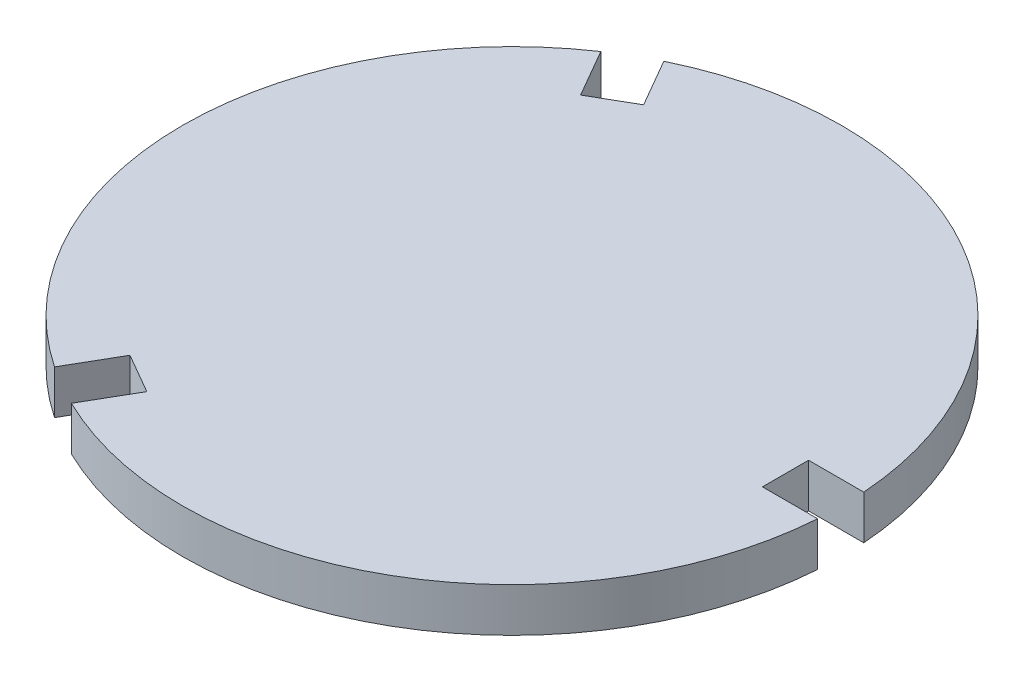
ISO-10303-21;
HEADER;
FILE_DESCRIPTION(('STEP AP214'),'2;1');
FILE_NAME('part.step','',(''),(''),'','','');
FILE_SCHEMA(('AUTOMOTIVE_DESIGN { 1 0 10303 214 1 1 1 1 }'));
ENDSEC;
DATA;
#1=APPLICATION_CONTEXT('core data for automotive mechanical design processes');
#2=APPLICATION_PROTOCOL_DEFINITION('international standard','automotive_design',2000,#1);
#3=PRODUCT_CONTEXT('',#1,'mechanical');
#4=PRODUCT('Part','Part','',(#3));
#5=PRODUCT_RELATED_PRODUCT_CATEGORY('part','',(#4));
#6=PRODUCT_DEFINITION_FORMATION('','',#4);
#7=PRODUCT_DEFINITION_CONTEXT('part definition',#1,'design');
#8=PRODUCT_DEFINITION('design','',#6,#7);
#9=PRODUCT_DEFINITION_SHAPE('','',#8);
#10=(LENGTH_UNIT() NAMED_UNIT(*) SI_UNIT(.MILLI.,.METRE.));
#11=(NAMED_UNIT(*) PLANE_ANGLE_UNIT() SI_UNIT($,.RADIAN.));
#12=(NAMED_UNIT(*) SI_UNIT($,.STERADIAN.) SOLID_ANGLE_UNIT());
#13=UNCERTAINTY_MEASURE_WITH_UNIT(LENGTH_MEASURE(1.E-05),#10,'distance_accuracy_value','');
#14=(GEOMETRIC_REPRESENTATION_CONTEXT(3) GLOBAL_UNCERTAINTY_ASSIGNED_CONTEXT((#13)) GLOBAL_UNIT_ASSIGNED_CONTEXT((#10,
#11,#12)) REPRESENTATION_CONTEXT('',''));
#15=CARTESIAN_POINT('',(0.,0.,0.));
#16=DIRECTION('',(0.,0.,1.));
#17=DIRECTION('',(1.,0.,0.));
#18=AXIS2_PLACEMENT_3D('',#15,#16,#17);
#19=CARTESIAN_POINT('',(0.,4.,0.));
#20=DIRECTION('',(0.,-1.,0.));
#21=DIRECTION('',(0.,0.,-1.));
#22=AXIS2_PLACEMENT_3D('',#19,#20,#21);
#23=CYLINDRICAL_SURFACE('',#22,30.);
#24=DIRECTION('',(0.,-1.,0.));
#25=VECTOR('',#24,1.);
#26=CARTESIAN_POINT('',(-16.7818582185622,4.,24.8670310799676));
#27=LINE('',#26,#25);
#28=CARTESIAN_POINT('',(-16.7818582185622,0.,24.8670310799676));
#29=VERTEX_POINT('',#28);
#30=CARTESIAN_POINT('',(-16.7818582185622,4.,24.8670310799676));
#31=VERTEX_POINT('',#30);
#32=EDGE_CURVE('E128',#29,#31,#27,.F.);
#33=ORIENTED_EDGE('',*,*,#32,.T.);
#34=CARTESIAN_POINT('',(0.,4.,0.));
#35=DIRECTION('',(0.,1.,0.));
#36=DIRECTION('',(0.,0.,1.));
#37=AXIS2_PLACEMENT_3D('',#34,#35,#36);
#38=CIRCLE('',#37,30.);
#39=CARTESIAN_POINT('',(-16.7818582185626,4.,-24.8670310799674));
#40=VERTEX_POINT('',#39);
#41=EDGE_CURVE('E43',#40,#31,#38,.T.);
#42=ORIENTED_EDGE('',*,*,#41,.F.);
#43=DIRECTION('',(0.,-1.,0.));
#44=VECTOR('',#43,1.);
#45=CARTESIAN_POINT('',(-16.7818582185626,4.,-24.8670310799674));
#46=LINE('',#45,#44);
#47=CARTESIAN_POINT('',(-16.7818582185626,0.,-24.8670310799674));
#48=VERTEX_POINT('',#47);
#49=EDGE_CURVE('E196',#40,#48,#46,.T.);
#50=ORIENTED_EDGE('',*,*,#49,.T.);
#51=CARTESIAN_POINT('',(0.,0.,0.));
#52=DIRECTION('',(0.,1.,0.));
#53=DIRECTION('',(0.,0.,1.));
#54=AXIS2_PLACEMENT_3D('',#51,#52,#53);
#55=CIRCLE('',#54,30.);
#56=EDGE_CURVE('E141',#48,#29,#55,.T.);
#57=ORIENTED_EDGE('',*,*,#56,.T.);
#58=EDGE_LOOP('',(#33,#42,#50,#57));
#59=FACE_BOUND('',#58,.T.);
#60=ADVANCED_FACE('F34',(#59),#23,.T.);
#61=DIRECTION('',(0.,-1.,0.));
#62=VECTOR('',#61,1.);
#63=CARTESIAN_POINT('',(-13.1445515226675,4.,26.9670310799676));
#64=LINE('',#63,#62);
#65=CARTESIAN_POINT('',(-13.1445515226675,4.,26.9670310799676));
#66=VERTEX_POINT('',#65);
#67=CARTESIAN_POINT('',(-13.1445515226675,0.,26.9670310799676));
#68=VERTEX_POINT('',#67);
#69=EDGE_CURVE('E142',#66,#68,#64,.T.);
#70=ORIENTED_EDGE('',*,*,#69,.T.);
#71=CARTESIAN_POINT('',(29.9264097412302,0.,2.1));
#72=VERTEX_POINT('',#71);
#73=EDGE_CURVE('E151',#68,#72,#55,.T.);
#74=ORIENTED_EDGE('',*,*,#73,.T.);
#75=DIRECTION('',(0.,-1.,0.));
#76=VECTOR('',#75,1.);
#77=CARTESIAN_POINT('',(29.9264097412302,4.,2.1));
#78=LINE('',#77,#76);
#79=CARTESIAN_POINT('',(29.9264097412302,4.,2.1));
#80=VERTEX_POINT('',#79);
#81=EDGE_CURVE('E171',#72,#80,#78,.F.);
#82=ORIENTED_EDGE('',*,*,#81,.T.);
#83=EDGE_CURVE('E44',#66,#80,#38,.T.);
#84=ORIENTED_EDGE('',*,*,#83,.F.);
#85=EDGE_LOOP('',(#70,#74,#82,#84));
#86=FACE_BOUND('',#85,.T.);
#87=ADVANCED_FACE('F214',(#86),#23,.T.);
#88=CARTESIAN_POINT('',(0.,4.,0.));
#89=DIRECTION('',(0.,1.,0.));
#90=DIRECTION('',(0.,0.,1.));
#91=AXIS2_PLACEMENT_3D('',#88,#89,#90);
#92=PLANE('',#91);
#93=ORIENTED_EDGE('',*,*,#41,.T.);
#94=DIRECTION('',(-0.499999999999992,0.,0.866025403784443));
#95=VECTOR('',#94,1.);
#96=CARTESIAN_POINT('',(-19.368653347947,4.,29.347491672834));
#97=LINE('',#96,#95);
#98=CARTESIAN_POINT('',(-14.2686533479471,4.,20.5140325542327));
#99=VERTEX_POINT('',#98);
#100=EDGE_CURVE('E125',#99,#31,#97,.T.);
#101=ORIENTED_EDGE('',*,*,#100,.F.);
#102=DIRECTION('',(-0.866025403784443,0.,-0.499999999999992));
#103=VECTOR('',#102,1.);
#104=CARTESIAN_POINT('',(-14.2686533479471,4.,20.5140325542327));
#105=LINE('',#104,#103);
#106=CARTESIAN_POINT('',(-10.6313466520525,4.,22.6140325542326));
#107=VERTEX_POINT('',#106);
#108=EDGE_CURVE('E134',#107,#99,#105,.T.);
#109=ORIENTED_EDGE('',*,*,#108,.F.);
#110=DIRECTION('',(0.499999999999992,0.,-0.866025403784443));
#111=VECTOR('',#110,1.);
#112=CARTESIAN_POINT('',(-15.7313466520524,4.,31.4474916728339));
#113=LINE('',#112,#111);
#114=EDGE_CURVE('E198',#66,#107,#113,.T.);
#115=ORIENTED_EDGE('',*,*,#114,.F.);
#116=ORIENTED_EDGE('',*,*,#83,.T.);
#117=DIRECTION('',(1.,0.,0.));
#118=VECTOR('',#117,1.);
#119=CARTESIAN_POINT('',(35.1,4.,2.1));
#120=LINE('',#119,#118);
#121=CARTESIAN_POINT('',(24.9,4.,2.1));
#122=VERTEX_POINT('',#121);
#123=EDGE_CURVE('E166',#122,#80,#120,.T.);
#124=ORIENTED_EDGE('',*,*,#123,.F.);
#125=DIRECTION('',(0.,0.,1.));
#126=VECTOR('',#125,1.);
#127=CARTESIAN_POINT('',(24.9,4.,2.1));
#128=LINE('',#127,#126);
#129=CARTESIAN_POINT('',(24.9,4.,-2.1));
#130=VERTEX_POINT('',#129);
#131=EDGE_CURVE('E169',#130,#122,#128,.T.);
#132=ORIENTED_EDGE('',*,*,#131,.F.);
#133=DIRECTION('',(-1.,0.,0.));
#134=VECTOR('',#133,1.);
#135=CARTESIAN_POINT('',(35.1,4.,-2.1));
#136=LINE('',#135,#134);
#137=CARTESIAN_POINT('',(29.9264097412302,4.,-2.1));
#138=VERTEX_POINT('',#137);
#139=EDGE_CURVE('E149',#138,#130,#136,.T.);
#140=ORIENTED_EDGE('',*,*,#139,.F.);
#141=CARTESIAN_POINT('',(-13.1445515226679,4.,-26.9670310799674));
#142=VERTEX_POINT('',#141);
#143=EDGE_CURVE('E11',#138,#142,#38,.T.);
#144=ORIENTED_EDGE('',*,*,#143,.T.);
#145=DIRECTION('',(-0.500000000000004,0.,-0.866025403784436));
#146=VECTOR('',#145,1.);
#147=CARTESIAN_POINT('',(-15.7313466520528,4.,-31.4474916728337));
#148=LINE('',#147,#146);
#149=CARTESIAN_POINT('',(-10.6313466520528,4.,-22.6140325542325));
#150=VERTEX_POINT('',#149);
#151=EDGE_CURVE('E189',#150,#142,#148,.T.);
#152=ORIENTED_EDGE('',*,*,#151,.F.);
#153=DIRECTION('',(0.866025403784436,0.,-0.500000000000004));
#154=VECTOR('',#153,1.);
#155=CARTESIAN_POINT('',(-10.6313466520528,4.,-22.6140325542325));
#156=LINE('',#155,#154);
#157=CARTESIAN_POINT('',(-14.2686533479474,4.,-20.5140325542325));
#158=VERTEX_POINT('',#157);
#159=EDGE_CURVE('E191',#158,#150,#156,.T.);
#160=ORIENTED_EDGE('',*,*,#159,.F.);
#161=DIRECTION('',(0.500000000000004,0.,0.866025403784436));
#162=VECTOR('',#161,1.);
#163=CARTESIAN_POINT('',(-19.3686533479475,4.,-29.3474916728337));
#164=LINE('',#163,#162);
#165=EDGE_CURVE('E147',#40,#158,#164,.T.);
#166=ORIENTED_EDGE('',*,*,#165,.F.);
#167=EDGE_LOOP('',(#93,#101,#109,#115,#116,#124,#132,#140,#144,#152,#160,#166));
#168=FACE_BOUND('',#167,.T.);
#169=ADVANCED_FACE('F145',(#168),#92,.T.);
#170=CARTESIAN_POINT('',(0.,0.,0.));
#171=DIRECTION('',(0.,1.,0.));
#172=DIRECTION('',(0.,0.,1.));
#173=AXIS2_PLACEMENT_3D('',#170,#171,#172);
#174=PLANE('',#173);
#175=DIRECTION('',(-0.499999999999992,0.,0.866025403784443));
#176=VECTOR('',#175,1.);
#177=CARTESIAN_POINT('',(-19.368653347947,0.,29.347491672834));
#178=LINE('',#177,#176);
#179=CARTESIAN_POINT('',(-14.2686533479471,0.,20.5140325542327));
#180=VERTEX_POINT('',#179);
#181=EDGE_CURVE('E51',#180,#29,#178,.T.);
#182=ORIENTED_EDGE('',*,*,#181,.T.);
#183=ORIENTED_EDGE('',*,*,#56,.F.);
#184=DIRECTION('',(0.500000000000004,0.,0.866025403784436));
#185=VECTOR('',#184,1.);
#186=CARTESIAN_POINT('',(-19.3686533479475,0.,-29.3474916728337));
#187=LINE('',#186,#185);
#188=CARTESIAN_POINT('',(-14.2686533479474,0.,-20.5140325542325));
#189=VERTEX_POINT('',#188);
#190=EDGE_CURVE('E182',#48,#189,#187,.T.);
#191=ORIENTED_EDGE('',*,*,#190,.T.);
#192=DIRECTION('',(0.866025403784436,0.,-0.500000000000004));
#193=VECTOR('',#192,1.);
#194=CARTESIAN_POINT('',(-10.6313466520528,0.,-22.6140325542325));
#195=LINE('',#194,#193);
#196=CARTESIAN_POINT('',(-10.6313466520528,0.,-22.6140325542325));
#197=VERTEX_POINT('',#196);
#198=EDGE_CURVE('E186',#189,#197,#195,.T.);
#199=ORIENTED_EDGE('',*,*,#198,.T.);
#200=DIRECTION('',(-0.500000000000004,0.,-0.866025403784436));
#201=VECTOR('',#200,1.);
#202=CARTESIAN_POINT('',(-15.7313466520528,0.,-31.4474916728337));
#203=LINE('',#202,#201);
#204=CARTESIAN_POINT('',(-13.1445515226679,0.,-26.9670310799674));
#205=VERTEX_POINT('',#204);
#206=EDGE_CURVE('E59',#197,#205,#203,.T.);
#207=ORIENTED_EDGE('',*,*,#206,.T.);
#208=CARTESIAN_POINT('',(29.9264097412302,0.,-2.1));
#209=VERTEX_POINT('',#208);
#210=EDGE_CURVE('E38',#209,#205,#55,.T.);
#211=ORIENTED_EDGE('',*,*,#210,.F.);
#212=DIRECTION('',(-1.,0.,0.));
#213=VECTOR('',#212,1.);
#214=CARTESIAN_POINT('',(35.1,0.,-2.1));
#215=LINE('',#214,#213);
#216=CARTESIAN_POINT('',(24.9,0.,-2.1));
#217=VERTEX_POINT('',#216);
#218=EDGE_CURVE('E157',#209,#217,#215,.T.);
#219=ORIENTED_EDGE('',*,*,#218,.T.);
#220=DIRECTION('',(0.,0.,1.));
#221=VECTOR('',#220,1.);
#222=CARTESIAN_POINT('',(24.9,0.,2.1));
#223=LINE('',#222,#221);
#224=CARTESIAN_POINT('',(24.9,0.,2.1));
#225=VERTEX_POINT('',#224);
#226=EDGE_CURVE('E163',#217,#225,#223,.T.);
#227=ORIENTED_EDGE('',*,*,#226,.T.);
#228=DIRECTION('',(1.,0.,0.));
#229=VECTOR('',#228,1.);
#230=CARTESIAN_POINT('',(35.1,0.,2.1));
#231=LINE('',#230,#229);
#232=EDGE_CURVE('E160',#225,#72,#231,.T.);
#233=ORIENTED_EDGE('',*,*,#232,.T.);
#234=ORIENTED_EDGE('',*,*,#73,.F.);
#235=DIRECTION('',(0.499999999999992,0.,-0.866025403784443));
#236=VECTOR('',#235,1.);
#237=CARTESIAN_POINT('',(-15.7313466520524,0.,31.4474916728339));
#238=LINE('',#237,#236);
#239=CARTESIAN_POINT('',(-10.6313466520525,0.,22.6140325542326));
#240=VERTEX_POINT('',#239);
#241=EDGE_CURVE('E203',#68,#240,#238,.T.);
#242=ORIENTED_EDGE('',*,*,#241,.T.);
#243=DIRECTION('',(-0.866025403784443,0.,-0.499999999999992));
#244=VECTOR('',#243,1.);
#245=CARTESIAN_POINT('',(-14.2686533479471,0.,20.5140325542327));
#246=LINE('',#245,#244);
#247=EDGE_CURVE('E133',#240,#180,#246,.T.);
#248=ORIENTED_EDGE('',*,*,#247,.T.);
#249=EDGE_LOOP('',(#182,#183,#191,#199,#207,#211,#219,#227,#233,#234,#242,#248));
#250=FACE_BOUND('',#249,.T.);
#251=ADVANCED_FACE('F219',(#250),#174,.F.);
#252=DIRECTION('',(0.,-1.,0.));
#253=VECTOR('',#252,1.);
#254=CARTESIAN_POINT('',(-13.1445515226679,4.,-26.9670310799674));
#255=LINE('',#254,#253);
#256=EDGE_CURVE('E193',#205,#142,#255,.F.);
#257=ORIENTED_EDGE('',*,*,#256,.T.);
#258=ORIENTED_EDGE('',*,*,#143,.F.);
#259=DIRECTION('',(0.,-1.,0.));
#260=VECTOR('',#259,1.);
#261=CARTESIAN_POINT('',(29.9264097412302,4.,-2.1));
#262=LINE('',#261,#260);
#263=EDGE_CURVE('E174',#138,#209,#262,.T.);
#264=ORIENTED_EDGE('',*,*,#263,.T.);
#265=ORIENTED_EDGE('',*,*,#210,.T.);
#266=EDGE_LOOP('',(#257,#258,#264,#265));
#267=FACE_BOUND('',#266,.T.);
#268=ADVANCED_FACE('F36',(#267),#23,.T.);
#269=CARTESIAN_POINT('',(35.1,4.001,2.1));
#270=DIRECTION('',(0.,0.,-1.));
#271=DIRECTION('',(-1.,0.,0.));
#272=AXIS2_PLACEMENT_3D('',#269,#270,#271);
#273=PLANE('',#272);
#274=ORIENTED_EDGE('',*,*,#232,.F.);
#275=DIRECTION('',(0.,-1.,0.));
#276=VECTOR('',#275,1.);
#277=CARTESIAN_POINT('',(24.9,4.001,2.1));
#278=LINE('',#277,#276);
#279=EDGE_CURVE('E152',#122,#225,#278,.T.);
#280=ORIENTED_EDGE('',*,*,#279,.F.);
#281=ORIENTED_EDGE('',*,*,#123,.T.);
#282=ORIENTED_EDGE('',*,*,#81,.F.);
#283=EDGE_LOOP('',(#274,#280,#281,#282));
#284=FACE_BOUND('',#283,.T.);
#285=ADVANCED_FACE('F241',(#284),#273,.T.);
#286=CARTESIAN_POINT('',(35.1,4.001,-2.1));
#287=DIRECTION('',(0.,0.,1.));
#288=DIRECTION('',(1.,0.,0.));
#289=AXIS2_PLACEMENT_3D('',#286,#287,#288);
#290=PLANE('',#289);
#291=ORIENTED_EDGE('',*,*,#139,.T.);
#292=DIRECTION('',(0.,-1.,0.));
#293=VECTOR('',#292,1.);
#294=CARTESIAN_POINT('',(24.9,4.001,-2.1));
#295=LINE('',#294,#293);
#296=EDGE_CURVE('E155',#130,#217,#295,.T.);
#297=ORIENTED_EDGE('',*,*,#296,.T.);
#298=ORIENTED_EDGE('',*,*,#218,.F.);
#299=ORIENTED_EDGE('',*,*,#263,.F.);
#300=EDGE_LOOP('',(#291,#297,#298,#299));
#301=FACE_BOUND('',#300,.T.);
#302=ADVANCED_FACE('F235',(#301),#290,.T.);
#303=CARTESIAN_POINT('',(24.9,4.001,2.1));
#304=DIRECTION('',(1.,0.,0.));
#305=DIRECTION('',(0.,0.,-1.));
#306=AXIS2_PLACEMENT_3D('',#303,#304,#305);
#307=PLANE('',#306);
#308=ORIENTED_EDGE('',*,*,#131,.T.);
#309=ORIENTED_EDGE('',*,*,#279,.T.);
#310=ORIENTED_EDGE('',*,*,#226,.F.);
#311=ORIENTED_EDGE('',*,*,#296,.F.);
#312=EDGE_LOOP('',(#308,#309,#310,#311));
#313=FACE_BOUND('',#312,.T.);
#314=ADVANCED_FACE('F238',(#313),#307,.T.);
#315=CARTESIAN_POINT('',(-15.7313466520528,4.001,-31.4474916728337));
#316=DIRECTION('',(-0.866025403784436,0.,0.500000000000004));
#317=DIRECTION('',(0.500000000000004,0.,0.866025403784436));
#318=AXIS2_PLACEMENT_3D('',#315,#316,#317);
#319=PLANE('',#318);
#320=ORIENTED_EDGE('',*,*,#206,.F.);
#321=DIRECTION('',(0.,-1.,0.));
#322=VECTOR('',#321,1.);
#323=CARTESIAN_POINT('',(-10.6313466520528,4.001,-22.6140325542325));
#324=LINE('',#323,#322);
#325=EDGE_CURVE('E178',#150,#197,#324,.T.);
#326=ORIENTED_EDGE('',*,*,#325,.F.);
#327=ORIENTED_EDGE('',*,*,#151,.T.);
#328=ORIENTED_EDGE('',*,*,#256,.F.);
#329=EDGE_LOOP('',(#320,#326,#327,#328));
#330=FACE_BOUND('',#329,.T.);
#331=ADVANCED_FACE('F229',(#330),#319,.T.);
#332=CARTESIAN_POINT('',(-19.3686533479475,4.001,-29.3474916728337));
#333=DIRECTION('',(0.866025403784436,0.,-0.500000000000004));
#334=DIRECTION('',(-0.500000000000004,0.,-0.866025403784436));
#335=AXIS2_PLACEMENT_3D('',#332,#333,#334);
#336=PLANE('',#335);
#337=ORIENTED_EDGE('',*,*,#165,.T.);
#338=DIRECTION('',(0.,-1.,0.));
#339=VECTOR('',#338,1.);
#340=CARTESIAN_POINT('',(-14.2686533479474,4.001,-20.5140325542325));
#341=LINE('',#340,#339);
#342=EDGE_CURVE('E180',#158,#189,#341,.T.);
#343=ORIENTED_EDGE('',*,*,#342,.T.);
#344=ORIENTED_EDGE('',*,*,#190,.F.);
#345=ORIENTED_EDGE('',*,*,#49,.F.);
#346=EDGE_LOOP('',(#337,#343,#344,#345));
#347=FACE_BOUND('',#346,.T.);
#348=ADVANCED_FACE('F276',(#347),#336,.T.);
#349=CARTESIAN_POINT('',(-10.6313466520528,4.001,-22.6140325542325));
#350=DIRECTION('',(-0.500000000000004,0.,-0.866025403784436));
#351=DIRECTION('',(-0.866025403784436,0.,0.500000000000004));
#352=AXIS2_PLACEMENT_3D('',#349,#350,#351);
#353=PLANE('',#352);
#354=ORIENTED_EDGE('',*,*,#159,.T.);
#355=ORIENTED_EDGE('',*,*,#325,.T.);
#356=ORIENTED_EDGE('',*,*,#198,.F.);
#357=ORIENTED_EDGE('',*,*,#342,.F.);
#358=EDGE_LOOP('',(#354,#355,#356,#357));
#359=FACE_BOUND('',#358,.T.);
#360=ADVANCED_FACE('F227',(#359),#353,.T.);
#361=CARTESIAN_POINT('',(-19.368653347947,4.001,29.347491672834));
#362=DIRECTION('',(0.866025403784443,0.,0.499999999999992));
#363=DIRECTION('',(0.499999999999992,0.,-0.866025403784443));
#364=AXIS2_PLACEMENT_3D('',#361,#362,#363);
#365=PLANE('',#364);
#366=ORIENTED_EDGE('',*,*,#181,.F.);
#367=DIRECTION('',(0.,-1.,0.));
#368=VECTOR('',#367,1.);
#369=CARTESIAN_POINT('',(-14.2686533479471,4.001,20.5140325542327));
#370=LINE('',#369,#368);
#371=EDGE_CURVE('E129',#99,#180,#370,.T.);
#372=ORIENTED_EDGE('',*,*,#371,.F.);
#373=ORIENTED_EDGE('',*,*,#100,.T.);
#374=ORIENTED_EDGE('',*,*,#32,.F.);
#375=EDGE_LOOP('',(#366,#372,#373,#374));
#376=FACE_BOUND('',#375,.T.);
#377=ADVANCED_FACE('F127',(#376),#365,.T.);
#378=CARTESIAN_POINT('',(-15.7313466520524,4.001,31.4474916728339));
#379=DIRECTION('',(-0.866025403784443,0.,-0.499999999999992));
#380=DIRECTION('',(-0.499999999999992,0.,0.866025403784443));
#381=AXIS2_PLACEMENT_3D('',#378,#379,#380);
#382=PLANE('',#381);
#383=ORIENTED_EDGE('',*,*,#114,.T.);
#384=DIRECTION('',(0.,-1.,0.));
#385=VECTOR('',#384,1.);
#386=CARTESIAN_POINT('',(-10.6313466520525,4.001,22.6140325542326));
#387=LINE('',#386,#385);
#388=EDGE_CURVE('E201',#107,#240,#387,.T.);
#389=ORIENTED_EDGE('',*,*,#388,.T.);
#390=ORIENTED_EDGE('',*,*,#241,.F.);
#391=ORIENTED_EDGE('',*,*,#69,.F.);
#392=EDGE_LOOP('',(#383,#389,#390,#391));
#393=FACE_BOUND('',#392,.T.);
#394=ADVANCED_FACE('F243',(#393),#382,.T.);
#395=CARTESIAN_POINT('',(-14.2686533479471,4.001,20.5140325542327));
#396=DIRECTION('',(-0.499999999999992,0.,0.866025403784443));
#397=DIRECTION('',(0.866025403784443,0.,0.499999999999992));
#398=AXIS2_PLACEMENT_3D('',#395,#396,#397);
#399=PLANE('',#398);
#400=ORIENTED_EDGE('',*,*,#108,.T.);
#401=ORIENTED_EDGE('',*,*,#371,.T.);
#402=ORIENTED_EDGE('',*,*,#247,.F.);
#403=ORIENTED_EDGE('',*,*,#388,.F.);
#404=EDGE_LOOP('',(#400,#401,#402,#403));
#405=FACE_BOUND('',#404,.T.);
#406=ADVANCED_FACE('F246',(#405),#399,.T.);
#407=CLOSED_SHELL('',(#60,#87,#169,#251,#268,#285,#302,#314,#331,#348,#360,#377,#394,#406));
#408=MANIFOLD_SOLID_BREP('B2',#407);
#409=ADVANCED_BREP_SHAPE_REPRESENTATION('',(#18,#408),#14);
#410=SHAPE_DEFINITION_REPRESENTATION(#9,#409);
ENDSEC;
END-ISO-10303-21;
